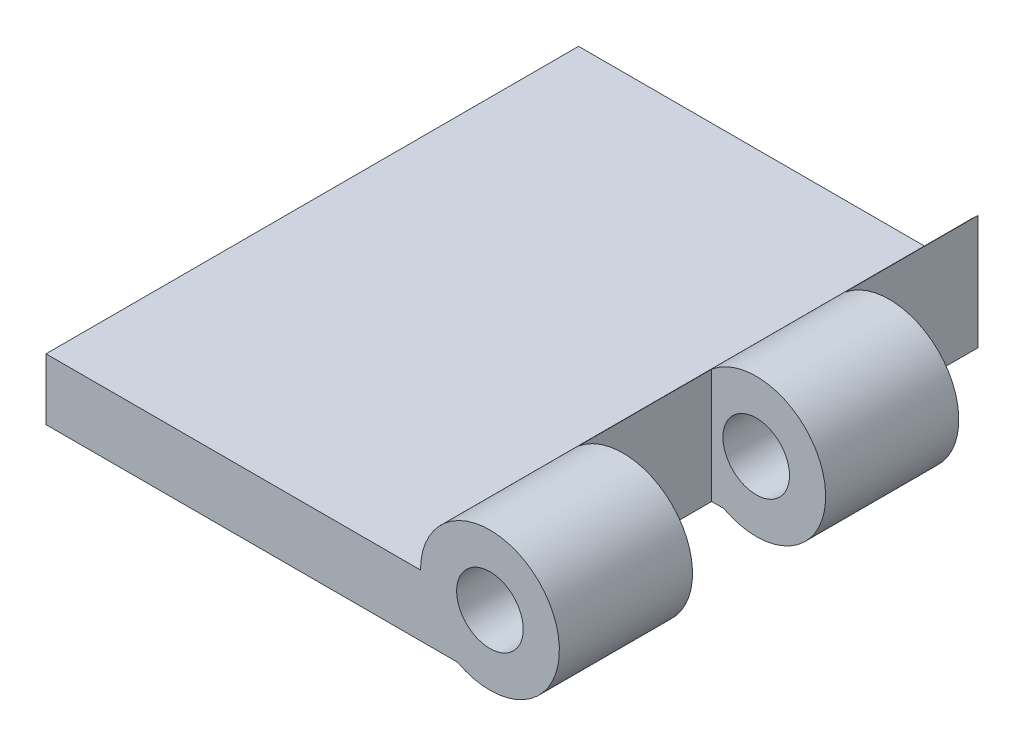
ISO-10303-21;
HEADER;
FILE_DESCRIPTION(('STEP AP214'),'2;1');
FILE_NAME('part.step','',(''),(''),'','','');
FILE_SCHEMA(('AUTOMOTIVE_DESIGN { 1 0 10303 214 1 1 1 1 }'));
ENDSEC;
DATA;
#1=APPLICATION_CONTEXT('core data for automotive mechanical design processes');
#2=APPLICATION_PROTOCOL_DEFINITION('international standard','automotive_design',2000,#1);
#3=PRODUCT_CONTEXT('',#1,'mechanical');
#4=PRODUCT('Part','Part','',(#3));
#5=PRODUCT_RELATED_PRODUCT_CATEGORY('part','',(#4));
#6=PRODUCT_DEFINITION_FORMATION('','',#4);
#7=PRODUCT_DEFINITION_CONTEXT('part definition',#1,'design');
#8=PRODUCT_DEFINITION('design','',#6,#7);
#9=PRODUCT_DEFINITION_SHAPE('','',#8);
#10=(LENGTH_UNIT() NAMED_UNIT(*) SI_UNIT(.MILLI.,.METRE.));
#11=(NAMED_UNIT(*) PLANE_ANGLE_UNIT() SI_UNIT($,.RADIAN.));
#12=(NAMED_UNIT(*) SI_UNIT($,.STERADIAN.) SOLID_ANGLE_UNIT());
#13=UNCERTAINTY_MEASURE_WITH_UNIT(LENGTH_MEASURE(1.E-05),#10,'distance_accuracy_value','');
#14=(GEOMETRIC_REPRESENTATION_CONTEXT(3) GLOBAL_UNCERTAINTY_ASSIGNED_CONTEXT((#13)) GLOBAL_UNIT_ASSIGNED_CONTEXT((#10,
#11,#12)) REPRESENTATION_CONTEXT('',''));
#15=CARTESIAN_POINT('',(0.,0.,0.));
#16=DIRECTION('',(0.,0.,1.));
#17=DIRECTION('',(1.,0.,0.));
#18=AXIS2_PLACEMENT_3D('',#15,#16,#17);
#19=CARTESIAN_POINT('',(4.24562179190865,268.577174681946,-50.8));
#20=DIRECTION('',(0.,0.,1.));
#21=DIRECTION('',(1.,0.,0.));
#22=AXIS2_PLACEMENT_3D('',#19,#20,#21);
#23=CYLINDRICAL_SURFACE('',#22,6.62280637946669);
#24=DIRECTION('',(0.,0.,1.));
#25=VECTOR('',#24,1.);
#26=CARTESIAN_POINT('',(1.14347256664049,262.725830005372,-50.8));
#27=LINE('',#26,#25);
#28=CARTESIAN_POINT('',(1.14347256664049,262.725830005372,-38.0999999906635));
#29=VERTEX_POINT('',#28);
#30=CARTESIAN_POINT('',(1.14347256664049,262.725830005372,-25.4));
#31=VERTEX_POINT('',#30);
#32=EDGE_CURVE('E41',#29,#31,#27,.T.);
#33=ORIENTED_EDGE('',*,*,#32,.F.);
#34=CARTESIAN_POINT('',(4.24562179190865,268.577174681946,-38.0999999906635));
#35=DIRECTION('',(0.,0.,1.));
#36=DIRECTION('',(1.,0.,0.));
#37=AXIS2_PLACEMENT_3D('',#34,#35,#36);
#38=CIRCLE('',#37,6.62280637946669);
#39=CARTESIAN_POINT('',(4.00966119927369E-12,273.660112802759,-38.0999999906635));
#40=VERTEX_POINT('',#39);
#41=EDGE_CURVE('E118',#40,#29,#38,.F.);
#42=ORIENTED_EDGE('',*,*,#41,.F.);
#43=DIRECTION('',(0.,0.,1.));
#44=VECTOR('',#43,1.);
#45=CARTESIAN_POINT('',(4.00807859124441E-12,273.660112802759,-50.8));
#46=LINE('',#45,#44);
#47=CARTESIAN_POINT('',(4.00792647579772E-12,273.660112802759,-50.8));
#48=VERTEX_POINT('',#47);
#49=EDGE_CURVE('E105',#48,#40,#46,.T.);
#50=ORIENTED_EDGE('',*,*,#49,.F.);
#51=CARTESIAN_POINT('',(4.24562179190865,268.577174681946,-50.8));
#52=DIRECTION('',(0.,0.,1.));
#53=DIRECTION('',(1.,0.,0.));
#54=AXIS2_PLACEMENT_3D('',#51,#52,#53);
#55=CIRCLE('',#54,6.62280637946669);
#56=CARTESIAN_POINT('',(-2.37718458755804,268.577174681946,-50.8));
#57=VERTEX_POINT('',#56);
#58=EDGE_CURVE('E116',#48,#57,#55,.T.);
#59=ORIENTED_EDGE('',*,*,#58,.T.);
#60=DIRECTION('',(0.,0.,1.));
#61=VECTOR('',#60,1.);
#62=CARTESIAN_POINT('',(-2.37718458755804,268.577174681946,-50.8));
#63=LINE('',#62,#61);
#64=CARTESIAN_POINT('',(-2.37718458755804,268.577174681946,0.));
#65=VERTEX_POINT('',#64);
#66=EDGE_CURVE('E140',#57,#65,#63,.T.);
#67=ORIENTED_EDGE('',*,*,#66,.T.);
#68=CARTESIAN_POINT('',(4.24562179190865,268.577174681946,0.));
#69=DIRECTION('',(0.,0.,1.));
#70=DIRECTION('',(1.,0.,0.));
#71=AXIS2_PLACEMENT_3D('',#68,#69,#70);
#72=CIRCLE('',#71,6.62280637946669);
#73=CARTESIAN_POINT('',(1.14347256664049,262.725830005372,0.));
#74=VERTEX_POINT('',#73);
#75=EDGE_CURVE('E141',#74,#65,#72,.T.);
#76=ORIENTED_EDGE('',*,*,#75,.F.);
#77=CARTESIAN_POINT('',(1.14347256664049,262.725830005372,-12.7));
#78=VERTEX_POINT('',#77);
#79=EDGE_CURVE('E150',#78,#74,#27,.T.);
#80=ORIENTED_EDGE('',*,*,#79,.F.);
#81=CARTESIAN_POINT('',(4.24562179190865,268.577174681946,-12.7));
#82=DIRECTION('',(0.,0.,1.));
#83=DIRECTION('',(1.,0.,0.));
#84=AXIS2_PLACEMENT_3D('',#81,#82,#83);
#85=CIRCLE('',#84,6.62280637946669);
#86=CARTESIAN_POINT('',(4.00792647579772E-12,273.660112802759,-12.7));
#87=VERTEX_POINT('',#86);
#88=EDGE_CURVE('E167',#87,#78,#85,.F.);
#89=ORIENTED_EDGE('',*,*,#88,.F.);
#90=DIRECTION('',(0.,0.,1.));
#91=VECTOR('',#90,1.);
#92=CARTESIAN_POINT('',(4.00981331472039E-12,273.660112802759,-50.8));
#93=LINE('',#92,#91);
#94=CARTESIAN_POINT('',(4.00807859124441E-12,273.660112802759,-25.4));
#95=VERTEX_POINT('',#94);
#96=EDGE_CURVE('E174',#95,#87,#93,.T.);
#97=ORIENTED_EDGE('',*,*,#96,.F.);
#98=CARTESIAN_POINT('',(4.24562179190865,268.577174681946,-25.4));
#99=DIRECTION('',(0.,0.,-1.));
#100=DIRECTION('',(-1.,0.,0.));
#101=AXIS2_PLACEMENT_3D('',#98,#99,#100);
#102=CIRCLE('',#101,6.62280637946669);
#103=EDGE_CURVE('E164',#31,#95,#102,.F.);
#104=ORIENTED_EDGE('',*,*,#103,.F.);
#105=EDGE_LOOP('',(#33,#42,#50,#59,#67,#76,#80,#89,#97,#104));
#106=FACE_BOUND('',#105,.T.);
#107=ADVANCED_FACE('F33',(#106),#23,.T.);
#108=CARTESIAN_POINT('',(4.24562179190865,268.577174681946,-50.8));
#109=DIRECTION('',(0.,0.,1.));
#110=DIRECTION('',(1.,0.,0.));
#111=AXIS2_PLACEMENT_3D('',#108,#109,#110);
#112=CYLINDRICAL_SURFACE('',#111,3.175);
#113=CARTESIAN_POINT('',(4.24562179190865,268.577174681946,-12.7));
#114=DIRECTION('',(0.,0.,1.));
#115=DIRECTION('',(1.,0.,0.));
#116=AXIS2_PLACEMENT_3D('',#113,#114,#115);
#117=CIRCLE('',#116,3.175);
#118=CARTESIAN_POINT('',(7.42062179190865,268.577174681946,-12.7));
#119=VERTEX_POINT('',#118);
#120=EDGE_CURVE('E161',#119,#119,#117,.F.);
#121=ORIENTED_EDGE('',*,*,#120,.T.);
#122=EDGE_LOOP('',(#121));
#123=FACE_BOUND('',#122,.T.);
#124=CARTESIAN_POINT('',(4.24562179190865,268.577174681946,0.));
#125=DIRECTION('',(0.,0.,1.));
#126=DIRECTION('',(1.,0.,0.));
#127=AXIS2_PLACEMENT_3D('',#124,#125,#126);
#128=CIRCLE('',#127,3.175);
#129=CARTESIAN_POINT('',(7.42062179190865,268.577174681946,0.));
#130=VERTEX_POINT('',#129);
#131=EDGE_CURVE('E133',#130,#130,#128,.T.);
#132=ORIENTED_EDGE('',*,*,#131,.T.);
#133=EDGE_LOOP('',(#132));
#134=FACE_BOUND('',#133,.T.);
#135=ADVANCED_FACE('F182',(#123,#134),#112,.F.);
#136=CARTESIAN_POINT('',(1.14347256664049,262.725830005372,-50.8));
#137=DIRECTION('',(0.,-1.,0.));
#138=DIRECTION('',(0.,0.,-1.));
#139=AXIS2_PLACEMENT_3D('',#136,#137,#138);
#140=PLANE('',#139);
#141=DIRECTION('',(-1.,0.,0.));
#142=VECTOR('',#141,1.);
#143=CARTESIAN_POINT('',(1.14347256664049,262.725830005372,-38.0999999906635));
#144=LINE('',#143,#142);
#145=CARTESIAN_POINT('',(4.00966119927369E-12,262.725830005372,-38.0999999906635));
#146=VERTEX_POINT('',#145);
#147=EDGE_CURVE('E213',#29,#146,#144,.T.);
#148=ORIENTED_EDGE('',*,*,#147,.F.);
#149=ORIENTED_EDGE('',*,*,#32,.T.);
#150=DIRECTION('',(1.,0.,0.));
#151=VECTOR('',#150,1.);
#152=CARTESIAN_POINT('',(1.14347256664049,262.725830005372,-25.4));
#153=LINE('',#152,#151);
#154=CARTESIAN_POINT('',(4.00786175080992E-12,262.725830005372,-25.4));
#155=VERTEX_POINT('',#154);
#156=EDGE_CURVE('E159',#155,#31,#153,.T.);
#157=ORIENTED_EDGE('',*,*,#156,.F.);
#158=DIRECTION('',(0.,0.,-1.));
#159=VECTOR('',#158,1.);
#160=CARTESIAN_POINT('',(4.00786175080992E-12,262.725830005372,-50.8));
#161=LINE('',#160,#159);
#162=CARTESIAN_POINT('',(4.00792647579772E-12,262.725830005372,-12.7));
#163=VERTEX_POINT('',#162);
#164=EDGE_CURVE('E11',#163,#155,#161,.T.);
#165=ORIENTED_EDGE('',*,*,#164,.F.);
#166=DIRECTION('',(-1.,0.,0.));
#167=VECTOR('',#166,1.);
#168=CARTESIAN_POINT('',(1.1434725666405,262.725830005372,-12.7));
#169=LINE('',#168,#167);
#170=EDGE_CURVE('E163',#78,#163,#169,.T.);
#171=ORIENTED_EDGE('',*,*,#170,.F.);
#172=ORIENTED_EDGE('',*,*,#79,.T.);
#173=DIRECTION('',(1.,0.,0.));
#174=VECTOR('',#173,1.);
#175=CARTESIAN_POINT('',(1.14347256664049,262.725830005372,0.));
#176=LINE('',#175,#174);
#177=CARTESIAN_POINT('',(-38.1,262.725830005372,0.));
#178=VERTEX_POINT('',#177);
#179=EDGE_CURVE('E125',#178,#74,#176,.T.);
#180=ORIENTED_EDGE('',*,*,#179,.F.);
#181=DIRECTION('',(0.,0.,1.));
#182=VECTOR('',#181,1.);
#183=CARTESIAN_POINT('',(-38.1,262.725830005372,-50.8));
#184=LINE('',#183,#182);
#185=CARTESIAN_POINT('',(-38.1,262.725830005372,-50.8));
#186=VERTEX_POINT('',#185);
#187=EDGE_CURVE('E151',#186,#178,#184,.T.);
#188=ORIENTED_EDGE('',*,*,#187,.F.);
#189=DIRECTION('',(1.,0.,0.));
#190=VECTOR('',#189,1.);
#191=CARTESIAN_POINT('',(1.14347256664049,262.725830005372,-50.8));
#192=LINE('',#191,#190);
#193=CARTESIAN_POINT('',(4.00807859124441E-12,262.725830005372,-50.8));
#194=VERTEX_POINT('',#193);
#195=EDGE_CURVE('E138',#186,#194,#192,.T.);
#196=ORIENTED_EDGE('',*,*,#195,.T.);
#197=DIRECTION('',(0.,0.,-1.));
#198=VECTOR('',#197,1.);
#199=CARTESIAN_POINT('',(4.00786175080992E-12,262.725830005372,-50.8));
#200=LINE('',#199,#198);
#201=EDGE_CURVE('E48',#146,#194,#200,.T.);
#202=ORIENTED_EDGE('',*,*,#201,.F.);
#203=EDGE_LOOP('',(#148,#149,#157,#165,#171,#172,#180,#188,#196,#202));
#204=FACE_BOUND('',#203,.T.);
#205=ADVANCED_FACE('F201',(#204),#140,.T.);
#206=CARTESIAN_POINT('',(-38.1,262.725830005372,-50.8));
#207=DIRECTION('',(-1.,0.,0.));
#208=DIRECTION('',(0.,0.,1.));
#209=AXIS2_PLACEMENT_3D('',#206,#207,#208);
#210=PLANE('',#209);
#211=DIRECTION('',(0.,-1.,0.));
#212=VECTOR('',#211,1.);
#213=CARTESIAN_POINT('',(-38.1,262.725830005372,0.));
#214=LINE('',#213,#212);
#215=CARTESIAN_POINT('',(-38.1,268.577174681946,0.));
#216=VERTEX_POINT('',#215);
#217=EDGE_CURVE('E130',#216,#178,#214,.T.);
#218=ORIENTED_EDGE('',*,*,#217,.F.);
#219=DIRECTION('',(0.,0.,1.));
#220=VECTOR('',#219,1.);
#221=CARTESIAN_POINT('',(-38.1,268.577174681946,-50.8));
#222=LINE('',#221,#220);
#223=CARTESIAN_POINT('',(-38.1,268.577174681946,-50.8));
#224=VERTEX_POINT('',#223);
#225=EDGE_CURVE('E153',#224,#216,#222,.T.);
#226=ORIENTED_EDGE('',*,*,#225,.F.);
#227=DIRECTION('',(0.,-1.,0.));
#228=VECTOR('',#227,1.);
#229=CARTESIAN_POINT('',(-38.1,262.725830005372,-50.8));
#230=LINE('',#229,#228);
#231=EDGE_CURVE('E127',#224,#186,#230,.T.);
#232=ORIENTED_EDGE('',*,*,#231,.T.);
#233=ORIENTED_EDGE('',*,*,#187,.T.);
#234=EDGE_LOOP('',(#218,#226,#232,#233));
#235=FACE_BOUND('',#234,.T.);
#236=ADVANCED_FACE('F198',(#235),#210,.T.);
#237=CARTESIAN_POINT('',(-2.37718458755804,268.577174681946,-50.8));
#238=DIRECTION('',(0.,1.,0.));
#239=DIRECTION('',(-1.,0.,0.));
#240=AXIS2_PLACEMENT_3D('',#237,#238,#239);
#241=PLANE('',#240);
#242=DIRECTION('',(-1.,0.,0.));
#243=VECTOR('',#242,1.);
#244=CARTESIAN_POINT('',(-2.37718458755804,268.577174681946,0.));
#245=LINE('',#244,#243);
#246=EDGE_CURVE('E144',#65,#216,#245,.T.);
#247=ORIENTED_EDGE('',*,*,#246,.F.);
#248=ORIENTED_EDGE('',*,*,#66,.F.);
#249=DIRECTION('',(-1.,0.,0.));
#250=VECTOR('',#249,1.);
#251=CARTESIAN_POINT('',(-2.37718458755804,268.577174681946,-50.8));
#252=LINE('',#251,#250);
#253=EDGE_CURVE('E124',#57,#224,#252,.T.);
#254=ORIENTED_EDGE('',*,*,#253,.T.);
#255=ORIENTED_EDGE('',*,*,#225,.T.);
#256=EDGE_LOOP('',(#247,#248,#254,#255));
#257=FACE_BOUND('',#256,.T.);
#258=ADVANCED_FACE('F195',(#257),#241,.T.);
#259=CARTESIAN_POINT('',(4.24562179190865,268.577174681946,-50.8));
#260=DIRECTION('',(0.,0.,1.));
#261=DIRECTION('',(1.,0.,0.));
#262=AXIS2_PLACEMENT_3D('',#259,#260,#261);
#263=PLANE('',#262);
#264=ORIENTED_EDGE('',*,*,#58,.F.);
#265=DIRECTION('',(0.,1.,0.));
#266=VECTOR('',#265,1.);
#267=CARTESIAN_POINT('',(4.00792647579772E-12,261.954368302479,-50.8));
#268=LINE('',#267,#266);
#269=EDGE_CURVE('E102',#194,#48,#268,.T.);
#270=ORIENTED_EDGE('',*,*,#269,.F.);
#271=ORIENTED_EDGE('',*,*,#195,.F.);
#272=ORIENTED_EDGE('',*,*,#231,.F.);
#273=ORIENTED_EDGE('',*,*,#253,.F.);
#274=EDGE_LOOP('',(#264,#270,#271,#272,#273));
#275=FACE_BOUND('',#274,.T.);
#276=ADVANCED_FACE('F121',(#275),#263,.F.);
#277=CARTESIAN_POINT('',(4.24562179190865,268.577174681946,0.));
#278=DIRECTION('',(0.,0.,1.));
#279=DIRECTION('',(1.,0.,0.));
#280=AXIS2_PLACEMENT_3D('',#277,#278,#279);
#281=PLANE('',#280);
#282=ORIENTED_EDGE('',*,*,#131,.F.);
#283=EDGE_LOOP('',(#282));
#284=FACE_BOUND('',#283,.T.);
#285=ORIENTED_EDGE('',*,*,#75,.T.);
#286=ORIENTED_EDGE('',*,*,#246,.T.);
#287=ORIENTED_EDGE('',*,*,#217,.T.);
#288=ORIENTED_EDGE('',*,*,#179,.T.);
#289=EDGE_LOOP('',(#285,#286,#287,#288));
#290=FACE_BOUND('',#289,.T.);
#291=ADVANCED_FACE('F184',(#284,#290),#281,.T.);
#292=CARTESIAN_POINT('',(4.24562179190865,268.577174681946,-38.0999999906635));
#293=DIRECTION('',(0.,0.,1.));
#294=DIRECTION('',(1.,0.,0.));
#295=AXIS2_PLACEMENT_3D('',#292,#293,#294);
#296=CIRCLE('',#295,3.175);
#297=CARTESIAN_POINT('',(7.42062179190865,268.577174681946,-38.0999999906635));
#298=VERTEX_POINT('',#297);
#299=EDGE_CURVE('E36',#298,#298,#296,.F.);
#300=ORIENTED_EDGE('',*,*,#299,.T.);
#301=EDGE_LOOP('',(#300));
#302=FACE_BOUND('',#301,.T.);
#303=CARTESIAN_POINT('',(4.24562179190865,268.577174681946,-25.4));
#304=DIRECTION('',(0.,0.,-1.));
#305=DIRECTION('',(-1.,0.,0.));
#306=AXIS2_PLACEMENT_3D('',#303,#304,#305);
#307=CIRCLE('',#306,3.175);
#308=CARTESIAN_POINT('',(1.07062179190866,268.577174681946,-25.4));
#309=VERTEX_POINT('',#308);
#310=EDGE_CURVE('E156',#309,#309,#307,.F.);
#311=ORIENTED_EDGE('',*,*,#310,.T.);
#312=EDGE_LOOP('',(#311));
#313=FACE_BOUND('',#312,.T.);
#314=ADVANCED_FACE('F187',(#302,#313),#112,.F.);
#315=CARTESIAN_POINT('',(10.8684281713753,261.954368302479,-12.7));
#316=DIRECTION('',(0.,0.,1.));
#317=DIRECTION('',(1.,0.,0.));
#318=AXIS2_PLACEMENT_3D('',#315,#316,#317);
#319=PLANE('',#318);
#320=ORIENTED_EDGE('',*,*,#88,.T.);
#321=ORIENTED_EDGE('',*,*,#170,.T.);
#322=DIRECTION('',(0.,1.,0.));
#323=VECTOR('',#322,1.);
#324=CARTESIAN_POINT('',(4.00792647579772E-12,261.954368302479,-12.7));
#325=LINE('',#324,#323);
#326=EDGE_CURVE('E160',#163,#87,#325,.T.);
#327=ORIENTED_EDGE('',*,*,#326,.T.);
#328=EDGE_LOOP('',(#320,#321,#327));
#329=FACE_BOUND('',#328,.T.);
#330=ORIENTED_EDGE('',*,*,#120,.F.);
#331=EDGE_LOOP('',(#330));
#332=FACE_BOUND('',#331,.T.);
#333=ADVANCED_FACE('F206',(#329,#332),#319,.F.);
#334=CARTESIAN_POINT('',(4.00792647579772E-12,261.954368302479,-25.4));
#335=DIRECTION('',(0.,0.,-1.));
#336=DIRECTION('',(-1.,0.,0.));
#337=AXIS2_PLACEMENT_3D('',#334,#335,#336);
#338=PLANE('',#337);
#339=ORIENTED_EDGE('',*,*,#103,.T.);
#340=DIRECTION('',(0.,1.,0.));
#341=VECTOR('',#340,1.);
#342=CARTESIAN_POINT('',(4.00792647579772E-12,261.954368302479,-25.4));
#343=LINE('',#342,#341);
#344=EDGE_CURVE('E56',#155,#95,#343,.T.);
#345=ORIENTED_EDGE('',*,*,#344,.F.);
#346=ORIENTED_EDGE('',*,*,#156,.T.);
#347=EDGE_LOOP('',(#339,#345,#346));
#348=FACE_BOUND('',#347,.T.);
#349=ORIENTED_EDGE('',*,*,#310,.F.);
#350=EDGE_LOOP('',(#349));
#351=FACE_BOUND('',#350,.T.);
#352=ADVANCED_FACE('F229',(#348,#351),#338,.F.);
#353=CARTESIAN_POINT('',(4.00792647579772E-12,261.954368302479,-12.7));
#354=DIRECTION('',(-1.,0.,0.));
#355=DIRECTION('',(0.,0.,1.));
#356=AXIS2_PLACEMENT_3D('',#353,#354,#355);
#357=PLANE('',#356);
#358=ORIENTED_EDGE('',*,*,#96,.T.);
#359=ORIENTED_EDGE('',*,*,#326,.F.);
#360=ORIENTED_EDGE('',*,*,#164,.T.);
#361=ORIENTED_EDGE('',*,*,#344,.T.);
#362=EDGE_LOOP('',(#358,#359,#360,#361));
#363=FACE_BOUND('',#362,.T.);
#364=ADVANCED_FACE('F208',(#363),#357,.F.);
#365=CARTESIAN_POINT('',(10.8684281713753,261.954368302479,-38.0999999906635));
#366=DIRECTION('',(0.,0.,1.));
#367=DIRECTION('',(1.,0.,0.));
#368=AXIS2_PLACEMENT_3D('',#365,#366,#367);
#369=PLANE('',#368);
#370=ORIENTED_EDGE('',*,*,#41,.T.);
#371=ORIENTED_EDGE('',*,*,#147,.T.);
#372=DIRECTION('',(0.,1.,0.));
#373=VECTOR('',#372,1.);
#374=CARTESIAN_POINT('',(4.00966119927369E-12,261.954368302479,-38.0999999906635));
#375=LINE('',#374,#373);
#376=EDGE_CURVE('E111',#146,#40,#375,.T.);
#377=ORIENTED_EDGE('',*,*,#376,.T.);
#378=EDGE_LOOP('',(#370,#371,#377));
#379=FACE_BOUND('',#378,.T.);
#380=ORIENTED_EDGE('',*,*,#299,.F.);
#381=EDGE_LOOP('',(#380));
#382=FACE_BOUND('',#381,.T.);
#383=ADVANCED_FACE('F221',(#379,#382),#369,.F.);
#384=CARTESIAN_POINT('',(4.00792647579772E-12,261.954368302479,-50.8));
#385=DIRECTION('',(-1.,0.,0.));
#386=DIRECTION('',(0.,0.,1.));
#387=AXIS2_PLACEMENT_3D('',#384,#385,#386);
#388=PLANE('',#387);
#389=ORIENTED_EDGE('',*,*,#49,.T.);
#390=ORIENTED_EDGE('',*,*,#376,.F.);
#391=ORIENTED_EDGE('',*,*,#201,.T.);
#392=ORIENTED_EDGE('',*,*,#269,.T.);
#393=EDGE_LOOP('',(#389,#390,#391,#392));
#394=FACE_BOUND('',#393,.T.);
#395=ADVANCED_FACE('F104',(#394),#388,.F.);
#396=CLOSED_SHELL('',(#107,#135,#205,#236,#258,#276,#291,#314,#333,#352,#364,#383,#395));
#397=MANIFOLD_SOLID_BREP('B2',#396);
#398=ADVANCED_BREP_SHAPE_REPRESENTATION('',(#18,#397),#14);
#399=SHAPE_DEFINITION_REPRESENTATION(#9,#398);
ENDSEC;
END-ISO-10303-21;
